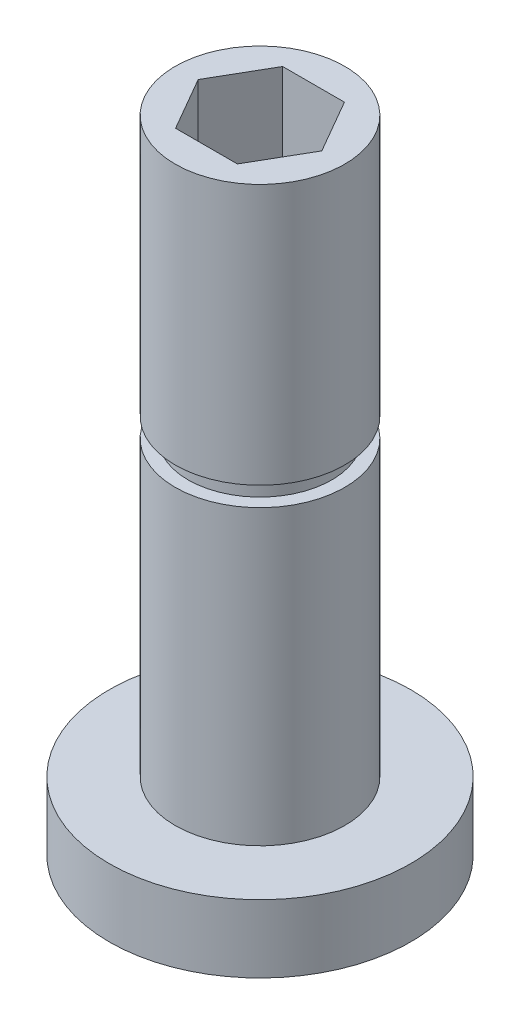
ISO-10303-21;
HEADER;
FILE_DESCRIPTION(('STEP AP214'),'2;1');
FILE_NAME('part.step','',(''),(''),'','','');
FILE_SCHEMA(('AUTOMOTIVE_DESIGN { 1 0 10303 214 1 1 1 1 }'));
ENDSEC;
DATA;
#1=APPLICATION_CONTEXT('core data for automotive mechanical design processes');
#2=APPLICATION_PROTOCOL_DEFINITION('international standard','automotive_design',2000,#1);
#3=PRODUCT_CONTEXT('',#1,'mechanical');
#4=PRODUCT('Part','Part','',(#3));
#5=PRODUCT_RELATED_PRODUCT_CATEGORY('part','',(#4));
#6=PRODUCT_DEFINITION_FORMATION('','',#4);
#7=PRODUCT_DEFINITION_CONTEXT('part definition',#1,'design');
#8=PRODUCT_DEFINITION('design','',#6,#7);
#9=PRODUCT_DEFINITION_SHAPE('','',#8);
#10=(LENGTH_UNIT() NAMED_UNIT(*) SI_UNIT(.MILLI.,.METRE.));
#11=(NAMED_UNIT(*) PLANE_ANGLE_UNIT() SI_UNIT($,.RADIAN.));
#12=(NAMED_UNIT(*) SI_UNIT($,.STERADIAN.) SOLID_ANGLE_UNIT());
#13=UNCERTAINTY_MEASURE_WITH_UNIT(LENGTH_MEASURE(1.E-05),#10,'distance_accuracy_value','');
#14=(GEOMETRIC_REPRESENTATION_CONTEXT(3) GLOBAL_UNCERTAINTY_ASSIGNED_CONTEXT((#13)) GLOBAL_UNIT_ASSIGNED_CONTEXT((#10,
#11,#12)) REPRESENTATION_CONTEXT('',''));
#15=CARTESIAN_POINT('',(0.,0.,0.));
#16=DIRECTION('',(0.,0.,1.));
#17=DIRECTION('',(1.,0.,0.));
#18=AXIS2_PLACEMENT_3D('',#15,#16,#17);
#19=CARTESIAN_POINT('',(0.,37.782,0.));
#20=DIRECTION('',(0.,-1.,0.));
#21=DIRECTION('',(0.,0.,-1.));
#22=AXIS2_PLACEMENT_3D('',#19,#20,#21);
#23=CYLINDRICAL_SURFACE('',#22,5.);
#24=CARTESIAN_POINT('',(0.,4.,0.));
#25=DIRECTION('',(0.,1.,0.));
#26=DIRECTION('',(0.,0.,1.));
#27=AXIS2_PLACEMENT_3D('',#24,#25,#26);
#28=CIRCLE('',#27,5.);
#29=CARTESIAN_POINT('',(0.,4.,5.));
#30=VERTEX_POINT('',#29);
#31=EDGE_CURVE('E154',#30,#30,#28,.T.);
#32=ORIENTED_EDGE('',*,*,#31,.T.);
#33=EDGE_LOOP('',(#32));
#34=FACE_BOUND('',#33,.T.);
#35=CARTESIAN_POINT('',(0.,21.272,0.));
#36=DIRECTION('',(0.,1.,0.));
#37=DIRECTION('',(0.,0.,1.));
#38=AXIS2_PLACEMENT_3D('',#35,#36,#37);
#39=CIRCLE('',#38,5.);
#40=CARTESIAN_POINT('',(0.,21.272,5.));
#41=VERTEX_POINT('',#40);
#42=EDGE_CURVE('E148',#41,#41,#39,.T.);
#43=ORIENTED_EDGE('',*,*,#42,.F.);
#44=EDGE_LOOP('',(#43));
#45=FACE_BOUND('',#44,.T.);
#46=ADVANCED_FACE('F37',(#34,#45),#23,.T.);
#47=CARTESIAN_POINT('',(0.,4.,0.));
#48=DIRECTION('',(0.,-1.,0.));
#49=DIRECTION('',(0.,0.,-1.));
#50=AXIS2_PLACEMENT_3D('',#47,#48,#49);
#51=CYLINDRICAL_SURFACE('',#50,8.89);
#52=CARTESIAN_POINT('',(0.,4.,0.));
#53=DIRECTION('',(0.,1.,0.));
#54=DIRECTION('',(0.,0.,1.));
#55=AXIS2_PLACEMENT_3D('',#52,#53,#54);
#56=CIRCLE('',#55,8.89);
#57=CARTESIAN_POINT('',(0.,4.,8.89));
#58=VERTEX_POINT('',#57);
#59=EDGE_CURVE('E11',#58,#58,#56,.T.);
#60=ORIENTED_EDGE('',*,*,#59,.F.);
#61=EDGE_LOOP('',(#60));
#62=FACE_BOUND('',#61,.T.);
#63=CARTESIAN_POINT('',(0.,0.,0.));
#64=DIRECTION('',(0.,1.,0.));
#65=DIRECTION('',(0.,0.,1.));
#66=AXIS2_PLACEMENT_3D('',#63,#64,#65);
#67=CIRCLE('',#66,8.89);
#68=CARTESIAN_POINT('',(0.,0.,8.89));
#69=VERTEX_POINT('',#68);
#70=EDGE_CURVE('E41',#69,#69,#67,.T.);
#71=ORIENTED_EDGE('',*,*,#70,.T.);
#72=EDGE_LOOP('',(#71));
#73=FACE_BOUND('',#72,.T.);
#74=ADVANCED_FACE('F39',(#62,#73),#51,.T.);
#75=CARTESIAN_POINT('',(0.,4.,0.));
#76=DIRECTION('',(0.,1.,0.));
#77=DIRECTION('',(0.,0.,1.));
#78=AXIS2_PLACEMENT_3D('',#75,#76,#77);
#79=PLANE('',#78);
#80=ORIENTED_EDGE('',*,*,#31,.F.);
#81=EDGE_LOOP('',(#80));
#82=FACE_BOUND('',#81,.T.);
#83=ORIENTED_EDGE('',*,*,#59,.T.);
#84=EDGE_LOOP('',(#83));
#85=FACE_BOUND('',#84,.T.);
#86=ADVANCED_FACE('F165',(#82,#85),#79,.T.);
#87=CARTESIAN_POINT('',(0.,0.,0.));
#88=DIRECTION('',(0.,1.,0.));
#89=DIRECTION('',(0.,0.,1.));
#90=AXIS2_PLACEMENT_3D('',#87,#88,#89);
#91=PLANE('',#90);
#92=ORIENTED_EDGE('',*,*,#70,.F.);
#93=EDGE_LOOP('',(#92));
#94=FACE_BOUND('',#93,.T.);
#95=ADVANCED_FACE('F168',(#94),#91,.F.);
#96=CARTESIAN_POINT('',(0.,22.415,0.));
#97=DIRECTION('',(0.,1.,0.));
#98=DIRECTION('',(0.,0.,1.));
#99=AXIS2_PLACEMENT_3D('',#96,#97,#98);
#100=PLANE('',#99);
#101=CARTESIAN_POINT('',(0.,22.415,0.));
#102=DIRECTION('',(0.,1.,0.));
#103=DIRECTION('',(0.,0.,1.));
#104=AXIS2_PLACEMENT_3D('',#101,#102,#103);
#105=CIRCLE('',#104,5.);
#106=CARTESIAN_POINT('',(0.,22.415,5.));
#107=VERTEX_POINT('',#106);
#108=EDGE_CURVE('E151',#107,#107,#105,.T.);
#109=ORIENTED_EDGE('',*,*,#108,.F.);
#110=EDGE_LOOP('',(#109));
#111=FACE_BOUND('',#110,.T.);
#112=CARTESIAN_POINT('',(0.,22.415,0.));
#113=DIRECTION('',(0.,1.,0.));
#114=DIRECTION('',(0.,0.,1.));
#115=AXIS2_PLACEMENT_3D('',#112,#113,#114);
#116=CIRCLE('',#115,4.238);
#117=CARTESIAN_POINT('',(0.,22.415,4.238));
#118=VERTEX_POINT('',#117);
#119=EDGE_CURVE('E145',#118,#118,#116,.T.);
#120=ORIENTED_EDGE('',*,*,#119,.T.);
#121=EDGE_LOOP('',(#120));
#122=FACE_BOUND('',#121,.T.);
#123=ADVANCED_FACE('F178',(#111,#122),#100,.F.);
#124=CARTESIAN_POINT('',(0.,21.272,0.));
#125=DIRECTION('',(0.,1.,0.));
#126=DIRECTION('',(0.,0.,1.));
#127=AXIS2_PLACEMENT_3D('',#124,#125,#126);
#128=PLANE('',#127);
#129=ORIENTED_EDGE('',*,*,#42,.T.);
#130=EDGE_LOOP('',(#129));
#131=FACE_BOUND('',#130,.T.);
#132=CARTESIAN_POINT('',(0.,21.272,0.));
#133=DIRECTION('',(0.,1.,0.));
#134=DIRECTION('',(0.,0.,1.));
#135=AXIS2_PLACEMENT_3D('',#132,#133,#134);
#136=CIRCLE('',#135,4.238);
#137=CARTESIAN_POINT('',(0.,21.272,4.238));
#138=VERTEX_POINT('',#137);
#139=EDGE_CURVE('E139',#138,#138,#136,.T.);
#140=ORIENTED_EDGE('',*,*,#139,.F.);
#141=EDGE_LOOP('',(#140));
#142=FACE_BOUND('',#141,.T.);
#143=ADVANCED_FACE('F182',(#131,#142),#128,.T.);
#144=CARTESIAN_POINT('',(0.,22.415,0.));
#145=DIRECTION('',(0.,-1.,0.));
#146=DIRECTION('',(0.,0.,-1.));
#147=AXIS2_PLACEMENT_3D('',#144,#145,#146);
#148=CYLINDRICAL_SURFACE('',#147,4.238);
#149=ORIENTED_EDGE('',*,*,#119,.F.);
#150=EDGE_LOOP('',(#149));
#151=FACE_BOUND('',#150,.T.);
#152=ORIENTED_EDGE('',*,*,#139,.T.);
#153=EDGE_LOOP('',(#152));
#154=FACE_BOUND('',#153,.T.);
#155=ADVANCED_FACE('F201',(#151,#154),#148,.T.);
#156=CARTESIAN_POINT('',(0.,37.782,0.));
#157=DIRECTION('',(0.,1.,0.));
#158=DIRECTION('',(0.,0.,1.));
#159=AXIS2_PLACEMENT_3D('',#156,#157,#158);
#160=PLANE('',#159);
#161=DIRECTION('',(0.5,0.,-0.866025403784439));
#162=VECTOR('',#161,1.);
#163=CARTESIAN_POINT('',(1.82245,37.782,3.15657599425395));
#164=LINE('',#163,#162);
#165=CARTESIAN_POINT('',(1.82245,37.782,3.15657599425395));
#166=VERTEX_POINT('',#165);
#167=CARTESIAN_POINT('',(3.64490000000001,37.782,0.));
#168=VERTEX_POINT('',#167);
#169=EDGE_CURVE('E52',#166,#168,#164,.T.);
#170=ORIENTED_EDGE('',*,*,#169,.F.);
#171=DIRECTION('',(1.,0.,0.));
#172=VECTOR('',#171,1.);
#173=CARTESIAN_POINT('',(-1.82245000000002,37.782,3.15657599425394));
#174=LINE('',#173,#172);
#175=CARTESIAN_POINT('',(-1.82245000000002,37.782,3.15657599425394));
#176=VERTEX_POINT('',#175);
#177=EDGE_CURVE('E135',#176,#166,#174,.T.);
#178=ORIENTED_EDGE('',*,*,#177,.F.);
#179=DIRECTION('',(0.5,0.,0.866025403784439));
#180=VECTOR('',#179,1.);
#181=CARTESIAN_POINT('',(-3.64490000000002,37.782,0.));
#182=LINE('',#181,#180);
#183=CARTESIAN_POINT('',(-3.64490000000002,37.782,0.));
#184=VERTEX_POINT('',#183);
#185=EDGE_CURVE('E133',#184,#176,#182,.T.);
#186=ORIENTED_EDGE('',*,*,#185,.F.);
#187=DIRECTION('',(-0.5,0.,0.866025403784439));
#188=VECTOR('',#187,1.);
#189=CARTESIAN_POINT('',(-1.82244999999999,37.782,-3.1565759942539));
#190=LINE('',#189,#188);
#191=CARTESIAN_POINT('',(-1.82244999999999,37.782,-3.1565759942539));
#192=VERTEX_POINT('',#191);
#193=EDGE_CURVE('E100',#192,#184,#190,.T.);
#194=ORIENTED_EDGE('',*,*,#193,.F.);
#195=DIRECTION('',(-1.,0.,0.));
#196=VECTOR('',#195,1.);
#197=CARTESIAN_POINT('',(1.82245000000001,37.782,-3.1565759942539));
#198=LINE('',#197,#196);
#199=CARTESIAN_POINT('',(1.82245000000001,37.782,-3.1565759942539));
#200=VERTEX_POINT('',#199);
#201=EDGE_CURVE('E129',#200,#192,#198,.T.);
#202=ORIENTED_EDGE('',*,*,#201,.F.);
#203=DIRECTION('',(-0.5,0.,-0.866025403784439));
#204=VECTOR('',#203,1.);
#205=CARTESIAN_POINT('',(3.64490000000001,37.782,0.));
#206=LINE('',#205,#204);
#207=EDGE_CURVE('E126',#168,#200,#206,.T.);
#208=ORIENTED_EDGE('',*,*,#207,.F.);
#209=EDGE_LOOP('',(#170,#178,#186,#194,#202,#208));
#210=FACE_BOUND('',#209,.T.);
#211=CARTESIAN_POINT('',(0.,37.782,0.));
#212=DIRECTION('',(0.,1.,0.));
#213=DIRECTION('',(0.,0.,1.));
#214=AXIS2_PLACEMENT_3D('',#211,#212,#213);
#215=CIRCLE('',#214,5.);
#216=CARTESIAN_POINT('',(0.,37.782,5.));
#217=VERTEX_POINT('',#216);
#218=EDGE_CURVE('E157',#217,#217,#215,.T.);
#219=ORIENTED_EDGE('',*,*,#218,.T.);
#220=EDGE_LOOP('',(#219));
#221=FACE_BOUND('',#220,.T.);
#222=ADVANCED_FACE('F193',(#210,#221),#160,.T.);
#223=ORIENTED_EDGE('',*,*,#108,.T.);
#224=EDGE_LOOP('',(#223));
#225=FACE_BOUND('',#224,.T.);
#226=ORIENTED_EDGE('',*,*,#218,.F.);
#227=EDGE_LOOP('',(#226));
#228=FACE_BOUND('',#227,.T.);
#229=ADVANCED_FACE('F187',(#225,#228),#23,.T.);
#230=CARTESIAN_POINT('',(1.82245,25.082,3.15657599425395));
#231=DIRECTION('',(0.866025403784439,0.,0.5));
#232=DIRECTION('',(0.5,0.,-0.866025403784439));
#233=AXIS2_PLACEMENT_3D('',#230,#231,#232);
#234=PLANE('',#233);
#235=ORIENTED_EDGE('',*,*,#169,.T.);
#236=DIRECTION('',(0.,1.,0.));
#237=VECTOR('',#236,1.);
#238=CARTESIAN_POINT('',(3.64490000000001,25.082,0.));
#239=LINE('',#238,#237);
#240=CARTESIAN_POINT('',(3.64490000000001,25.082,0.));
#241=VERTEX_POINT('',#240);
#242=EDGE_CURVE('E82',#241,#168,#239,.T.);
#243=ORIENTED_EDGE('',*,*,#242,.F.);
#244=DIRECTION('',(0.5,0.,-0.866025403784439));
#245=VECTOR('',#244,1.);
#246=CARTESIAN_POINT('',(1.82245,25.082,3.15657599425395));
#247=LINE('',#246,#245);
#248=CARTESIAN_POINT('',(1.82245,25.082,3.15657599425395));
#249=VERTEX_POINT('',#248);
#250=EDGE_CURVE('E137',#249,#241,#247,.T.);
#251=ORIENTED_EDGE('',*,*,#250,.F.);
#252=DIRECTION('',(0.,1.,0.));
#253=VECTOR('',#252,1.);
#254=CARTESIAN_POINT('',(1.82245,25.082,3.15657599425395));
#255=LINE('',#254,#253);
#256=EDGE_CURVE('E60',#249,#166,#255,.T.);
#257=ORIENTED_EDGE('',*,*,#256,.T.);
#258=EDGE_LOOP('',(#235,#243,#251,#257));
#259=FACE_BOUND('',#258,.T.);
#260=ADVANCED_FACE('F192',(#259),#234,.F.);
#261=CARTESIAN_POINT('',(-1.82245000000002,25.082,3.15657599425394));
#262=DIRECTION('',(0.,0.,1.));
#263=DIRECTION('',(1.,0.,0.));
#264=AXIS2_PLACEMENT_3D('',#261,#262,#263);
#265=PLANE('',#264);
#266=ORIENTED_EDGE('',*,*,#177,.T.);
#267=ORIENTED_EDGE('',*,*,#256,.F.);
#268=DIRECTION('',(1.,0.,0.));
#269=VECTOR('',#268,1.);
#270=CARTESIAN_POINT('',(-1.82245000000002,25.082,3.15657599425394));
#271=LINE('',#270,#269);
#272=CARTESIAN_POINT('',(-1.82245000000002,25.082,3.15657599425394));
#273=VERTEX_POINT('',#272);
#274=EDGE_CURVE('E112',#273,#249,#271,.T.);
#275=ORIENTED_EDGE('',*,*,#274,.F.);
#276=DIRECTION('',(0.,1.,0.));
#277=VECTOR('',#276,1.);
#278=CARTESIAN_POINT('',(-1.82245000000002,25.082,3.15657599425394));
#279=LINE('',#278,#277);
#280=EDGE_CURVE('E104',#273,#176,#279,.T.);
#281=ORIENTED_EDGE('',*,*,#280,.T.);
#282=EDGE_LOOP('',(#266,#267,#275,#281));
#283=FACE_BOUND('',#282,.T.);
#284=ADVANCED_FACE('F199',(#283),#265,.F.);
#285=CARTESIAN_POINT('',(-3.64490000000002,25.082,0.));
#286=DIRECTION('',(-0.866025403784439,0.,0.5));
#287=DIRECTION('',(0.5,0.,0.866025403784439));
#288=AXIS2_PLACEMENT_3D('',#285,#286,#287);
#289=PLANE('',#288);
#290=ORIENTED_EDGE('',*,*,#185,.T.);
#291=ORIENTED_EDGE('',*,*,#280,.F.);
#292=DIRECTION('',(0.5,0.,0.866025403784439));
#293=VECTOR('',#292,1.);
#294=CARTESIAN_POINT('',(-3.64490000000002,25.082,0.));
#295=LINE('',#294,#293);
#296=CARTESIAN_POINT('',(-3.64490000000002,25.082,0.));
#297=VERTEX_POINT('',#296);
#298=EDGE_CURVE('E108',#297,#273,#295,.T.);
#299=ORIENTED_EDGE('',*,*,#298,.F.);
#300=DIRECTION('',(0.,1.,0.));
#301=VECTOR('',#300,1.);
#302=CARTESIAN_POINT('',(-3.64490000000002,25.082,0.));
#303=LINE('',#302,#301);
#304=EDGE_CURVE('E93',#297,#184,#303,.T.);
#305=ORIENTED_EDGE('',*,*,#304,.T.);
#306=EDGE_LOOP('',(#290,#291,#299,#305));
#307=FACE_BOUND('',#306,.T.);
#308=ADVANCED_FACE('F109',(#307),#289,.F.);
#309=CARTESIAN_POINT('',(-1.82244999999999,25.082,-3.1565759942539));
#310=DIRECTION('',(-0.866025403784439,0.,-0.5));
#311=DIRECTION('',(-0.5,0.,0.866025403784439));
#312=AXIS2_PLACEMENT_3D('',#309,#310,#311);
#313=PLANE('',#312);
#314=ORIENTED_EDGE('',*,*,#193,.T.);
#315=ORIENTED_EDGE('',*,*,#304,.F.);
#316=DIRECTION('',(-0.5,0.,0.866025403784439));
#317=VECTOR('',#316,1.);
#318=CARTESIAN_POINT('',(-1.82244999999999,25.082,-3.1565759942539));
#319=LINE('',#318,#317);
#320=CARTESIAN_POINT('',(-1.82244999999999,25.082,-3.1565759942539));
#321=VERTEX_POINT('',#320);
#322=EDGE_CURVE('E97',#321,#297,#319,.T.);
#323=ORIENTED_EDGE('',*,*,#322,.F.);
#324=DIRECTION('',(0.,1.,0.));
#325=VECTOR('',#324,1.);
#326=CARTESIAN_POINT('',(-1.82244999999999,25.082,-3.1565759942539));
#327=LINE('',#326,#325);
#328=EDGE_CURVE('E105',#321,#192,#327,.T.);
#329=ORIENTED_EDGE('',*,*,#328,.T.);
#330=EDGE_LOOP('',(#314,#315,#323,#329));
#331=FACE_BOUND('',#330,.T.);
#332=ADVANCED_FACE('F95',(#331),#313,.F.);
#333=CARTESIAN_POINT('',(1.82245000000001,25.082,-3.1565759942539));
#334=DIRECTION('',(0.,0.,-1.));
#335=DIRECTION('',(-1.,0.,0.));
#336=AXIS2_PLACEMENT_3D('',#333,#334,#335);
#337=PLANE('',#336);
#338=ORIENTED_EDGE('',*,*,#201,.T.);
#339=ORIENTED_EDGE('',*,*,#328,.F.);
#340=DIRECTION('',(-1.,0.,0.));
#341=VECTOR('',#340,1.);
#342=CARTESIAN_POINT('',(1.82245000000001,25.082,-3.1565759942539));
#343=LINE('',#342,#341);
#344=CARTESIAN_POINT('',(1.82245000000001,25.082,-3.1565759942539));
#345=VERTEX_POINT('',#344);
#346=EDGE_CURVE('E118',#345,#321,#343,.T.);
#347=ORIENTED_EDGE('',*,*,#346,.F.);
#348=DIRECTION('',(0.,1.,0.));
#349=VECTOR('',#348,1.);
#350=CARTESIAN_POINT('',(1.82245000000001,25.082,-3.1565759942539));
#351=LINE('',#350,#349);
#352=EDGE_CURVE('E142',#345,#200,#351,.T.);
#353=ORIENTED_EDGE('',*,*,#352,.T.);
#354=EDGE_LOOP('',(#338,#339,#347,#353));
#355=FACE_BOUND('',#354,.T.);
#356=ADVANCED_FACE('F224',(#355),#337,.F.);
#357=CARTESIAN_POINT('',(3.64490000000001,25.082,0.));
#358=DIRECTION('',(0.866025403784439,0.,-0.5));
#359=DIRECTION('',(-0.5,0.,-0.866025403784439));
#360=AXIS2_PLACEMENT_3D('',#357,#358,#359);
#361=PLANE('',#360);
#362=ORIENTED_EDGE('',*,*,#207,.T.);
#363=ORIENTED_EDGE('',*,*,#352,.F.);
#364=DIRECTION('',(-0.5,0.,-0.866025403784439));
#365=VECTOR('',#364,1.);
#366=CARTESIAN_POINT('',(3.64490000000001,25.082,0.));
#367=LINE('',#366,#365);
#368=EDGE_CURVE('E120',#241,#345,#367,.T.);
#369=ORIENTED_EDGE('',*,*,#368,.F.);
#370=ORIENTED_EDGE('',*,*,#242,.T.);
#371=EDGE_LOOP('',(#362,#363,#369,#370));
#372=FACE_BOUND('',#371,.T.);
#373=ADVANCED_FACE('F221',(#372),#361,.F.);
#374=CARTESIAN_POINT('',(0.,25.082,0.));
#375=DIRECTION('',(0.,1.,0.));
#376=DIRECTION('',(0.,0.,1.));
#377=AXIS2_PLACEMENT_3D('',#374,#375,#376);
#378=PLANE('',#377);
#379=ORIENTED_EDGE('',*,*,#250,.T.);
#380=ORIENTED_EDGE('',*,*,#368,.T.);
#381=ORIENTED_EDGE('',*,*,#346,.T.);
#382=ORIENTED_EDGE('',*,*,#322,.T.);
#383=ORIENTED_EDGE('',*,*,#298,.T.);
#384=ORIENTED_EDGE('',*,*,#274,.T.);
#385=EDGE_LOOP('',(#379,#380,#381,#382,#383,#384));
#386=FACE_BOUND('',#385,.T.);
#387=ADVANCED_FACE('F115',(#386),#378,.T.);
#388=CLOSED_SHELL('',(#46,#74,#86,#95,#123,#143,#155,#222,#229,#260,#284,#308,#332,#356,#373,#387));
#389=MANIFOLD_SOLID_BREP('B2',#388);
#390=ADVANCED_BREP_SHAPE_REPRESENTATION('',(#18,#389),#14);
#391=SHAPE_DEFINITION_REPRESENTATION(#9,#390);
ENDSEC;
END-ISO-10303-21;
